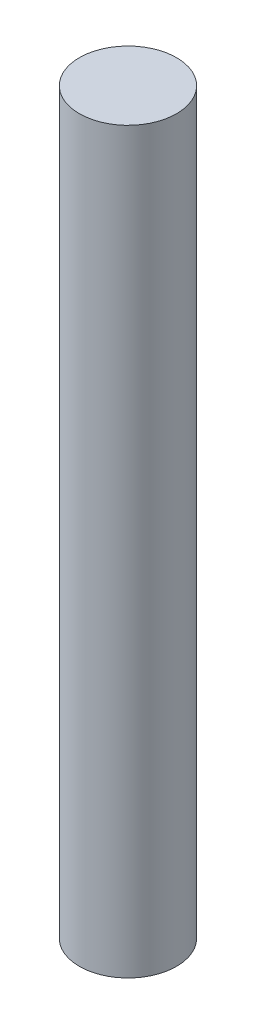
ISO-10303-21;
HEADER;
FILE_DESCRIPTION(('STEP AP214'),'2;1');
FILE_NAME('part.step','',(''),(''),'','','');
FILE_SCHEMA(('AUTOMOTIVE_DESIGN { 1 0 10303 214 1 1 1 1 }'));
ENDSEC;
DATA;
#1=APPLICATION_CONTEXT('core data for automotive mechanical design processes');
#2=APPLICATION_PROTOCOL_DEFINITION('international standard','automotive_design',2000,#1);
#3=PRODUCT_CONTEXT('',#1,'mechanical');
#4=PRODUCT('Part','Part','',(#3));
#5=PRODUCT_RELATED_PRODUCT_CATEGORY('part','',(#4));
#6=PRODUCT_DEFINITION_FORMATION('','',#4);
#7=PRODUCT_DEFINITION_CONTEXT('part definition',#1,'design');
#8=PRODUCT_DEFINITION('design','',#6,#7);
#9=PRODUCT_DEFINITION_SHAPE('','',#8);
#10=(LENGTH_UNIT() NAMED_UNIT(*) SI_UNIT(.MILLI.,.METRE.));
#11=(NAMED_UNIT(*) PLANE_ANGLE_UNIT() SI_UNIT($,.RADIAN.));
#12=(NAMED_UNIT(*) SI_UNIT($,.STERADIAN.) SOLID_ANGLE_UNIT());
#13=UNCERTAINTY_MEASURE_WITH_UNIT(LENGTH_MEASURE(1.E-05),#10,'distance_accuracy_value','');
#14=(GEOMETRIC_REPRESENTATION_CONTEXT(3) GLOBAL_UNCERTAINTY_ASSIGNED_CONTEXT((#13)) GLOBAL_UNIT_ASSIGNED_CONTEXT((#10,
#11,#12)) REPRESENTATION_CONTEXT('',''));
#15=CARTESIAN_POINT('',(0.,0.,0.));
#16=DIRECTION('',(0.,0.,1.));
#17=DIRECTION('',(1.,0.,0.));
#18=AXIS2_PLACEMENT_3D('',#15,#16,#17);
#19=CARTESIAN_POINT('',(0.,38.,0.));
#20=DIRECTION('',(0.,-1.,0.));
#21=DIRECTION('',(0.,0.,-1.));
#22=AXIS2_PLACEMENT_3D('',#19,#20,#21);
#23=CYLINDRICAL_SURFACE('',#22,2.5);
#24=CARTESIAN_POINT('',(0.,38.,0.));
#25=DIRECTION('',(0.,1.,0.));
#26=DIRECTION('',(0.,0.,1.));
#27=AXIS2_PLACEMENT_3D('',#24,#25,#26);
#28=CIRCLE('',#27,2.5);
#29=CARTESIAN_POINT('',(0.,38.,2.5));
#30=VERTEX_POINT('',#29);
#31=EDGE_CURVE('E10',#30,#30,#28,.T.);
#32=ORIENTED_EDGE('',*,*,#31,.F.);
#33=EDGE_LOOP('',(#32));
#34=FACE_BOUND('',#33,.T.);
#35=CARTESIAN_POINT('',(0.,0.,0.));
#36=DIRECTION('',(0.,1.,0.));
#37=DIRECTION('',(0.,0.,1.));
#38=AXIS2_PLACEMENT_3D('',#35,#36,#37);
#39=CIRCLE('',#38,2.5);
#40=CARTESIAN_POINT('',(0.,0.,2.5));
#41=VERTEX_POINT('',#40);
#42=EDGE_CURVE('E37',#41,#41,#39,.T.);
#43=ORIENTED_EDGE('',*,*,#42,.T.);
#44=EDGE_LOOP('',(#43));
#45=FACE_BOUND('',#44,.T.);
#46=ADVANCED_FACE('F34',(#34,#45),#23,.T.);
#47=CARTESIAN_POINT('',(0.,38.,0.));
#48=DIRECTION('',(0.,1.,0.));
#49=DIRECTION('',(0.,0.,1.));
#50=AXIS2_PLACEMENT_3D('',#47,#48,#49);
#51=PLANE('',#50);
#52=ORIENTED_EDGE('',*,*,#31,.T.);
#53=EDGE_LOOP('',(#52));
#54=FACE_BOUND('',#53,.T.);
#55=ADVANCED_FACE('F49',(#54),#51,.T.);
#56=CARTESIAN_POINT('',(0.,0.,0.));
#57=DIRECTION('',(0.,1.,0.));
#58=DIRECTION('',(0.,0.,1.));
#59=AXIS2_PLACEMENT_3D('',#56,#57,#58);
#60=PLANE('',#59);
#61=ORIENTED_EDGE('',*,*,#42,.F.);
#62=EDGE_LOOP('',(#61));
#63=FACE_BOUND('',#62,.T.);
#64=ADVANCED_FACE('F47',(#63),#60,.F.);
#65=CLOSED_SHELL('',(#46,#55,#64));
#66=MANIFOLD_SOLID_BREP('B2',#65);
#67=ADVANCED_BREP_SHAPE_REPRESENTATION('',(#18,#66),#14);
#68=SHAPE_DEFINITION_REPRESENTATION(#9,#67);
ENDSEC;
END-ISO-10303-21;
